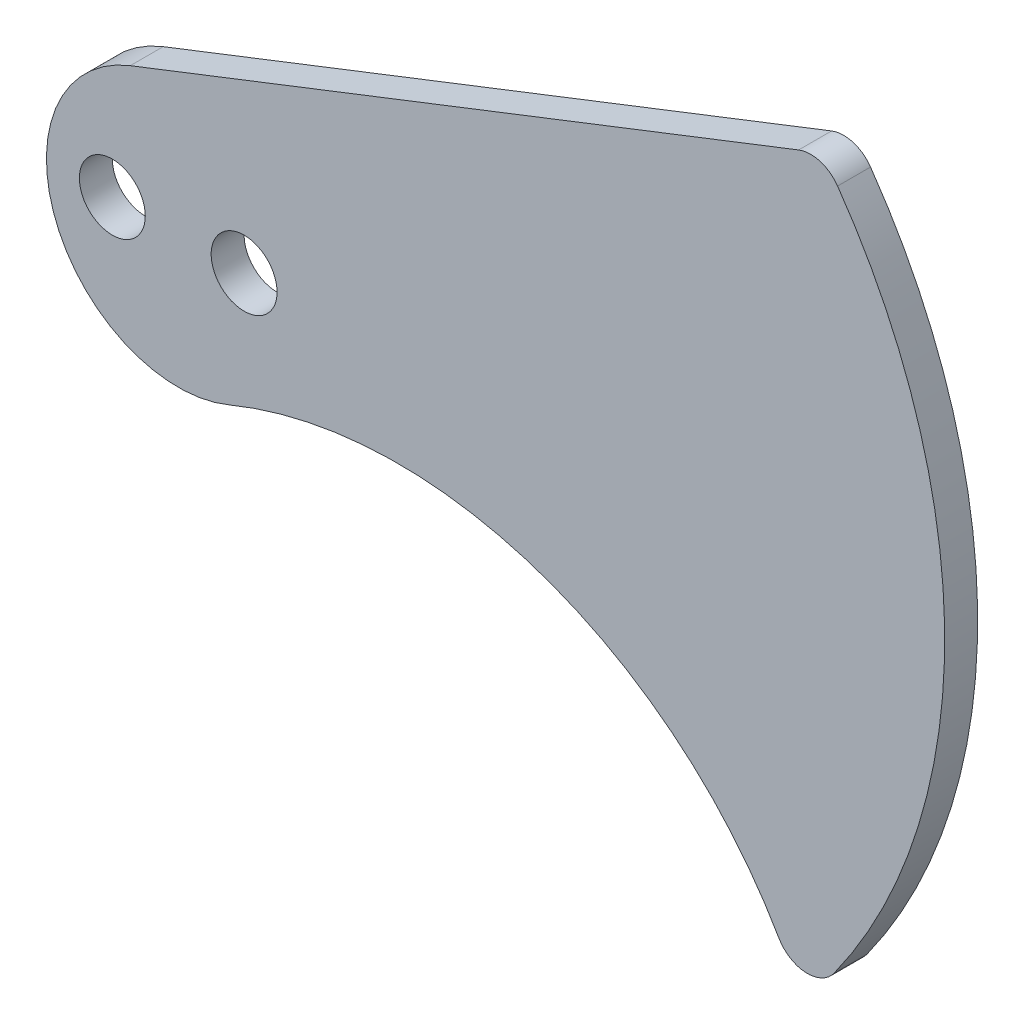
ISO-10303-21;
HEADER;
FILE_DESCRIPTION(('STEP AP214'),'2;1');
FILE_NAME('part.step','',(''),(''),'','','');
FILE_SCHEMA(('AUTOMOTIVE_DESIGN { 1 0 10303 214 1 1 1 1 }'));
ENDSEC;
DATA;
#1=APPLICATION_CONTEXT('core data for automotive mechanical design processes');
#2=APPLICATION_PROTOCOL_DEFINITION('international standard','automotive_design',2000,#1);
#3=PRODUCT_CONTEXT('',#1,'mechanical');
#4=PRODUCT('Part','Part','',(#3));
#5=PRODUCT_RELATED_PRODUCT_CATEGORY('part','',(#4));
#6=PRODUCT_DEFINITION_FORMATION('','',#4);
#7=PRODUCT_DEFINITION_CONTEXT('part definition',#1,'design');
#8=PRODUCT_DEFINITION('design','',#6,#7);
#9=PRODUCT_DEFINITION_SHAPE('','',#8);
#10=(LENGTH_UNIT() NAMED_UNIT(*) SI_UNIT(.MILLI.,.METRE.));
#11=(NAMED_UNIT(*) PLANE_ANGLE_UNIT() SI_UNIT($,.RADIAN.));
#12=(NAMED_UNIT(*) SI_UNIT($,.STERADIAN.) SOLID_ANGLE_UNIT());
#13=UNCERTAINTY_MEASURE_WITH_UNIT(LENGTH_MEASURE(1.E-05),#10,'distance_accuracy_value','');
#14=(GEOMETRIC_REPRESENTATION_CONTEXT(3) GLOBAL_UNCERTAINTY_ASSIGNED_CONTEXT((#13)) GLOBAL_UNIT_ASSIGNED_CONTEXT((#10,
#11,#12)) REPRESENTATION_CONTEXT('',''));
#15=CARTESIAN_POINT('',(0.,0.,0.));
#16=DIRECTION('',(0.,0.,1.));
#17=DIRECTION('',(1.,0.,0.));
#18=AXIS2_PLACEMENT_3D('',#15,#16,#17);
#19=CARTESIAN_POINT('',(20.,-60.,3.));
#20=DIRECTION('',(0.,0.,-1.));
#21=DIRECTION('',(-1.,0.,0.));
#22=AXIS2_PLACEMENT_3D('',#19,#20,#21);
#23=PLANE('',#22);
#24=CARTESIAN_POINT('',(20.,-60.,3.));
#25=DIRECTION('',(0.,0.,-1.));
#26=DIRECTION('',(-1.,0.,0.));
#27=AXIS2_PLACEMENT_3D('',#24,#25,#26);
#28=CIRCLE('',#27,40.);
#29=CARTESIAN_POINT('',(4.61538461538461,-23.0769230769231,3.));
#30=VERTEX_POINT('',#29);
#31=CARTESIAN_POINT('',(54.6838076185731,-40.074300788233,3.));
#32=VERTEX_POINT('',#31);
#33=EDGE_CURVE('E135',#30,#32,#28,.T.);
#34=ORIENTED_EDGE('',*,*,#33,.T.);
#35=CARTESIAN_POINT('',(57.285093189966,-38.5798733473504,3.));
#36=DIRECTION('',(0.,0.,1.));
#37=DIRECTION('',(1.,0.,0.));
#38=AXIS2_PLACEMENT_3D('',#35,#36,#37);
#39=CIRCLE('',#38,3.);
#40=CARTESIAN_POINT('',(59.7237620550911,-40.3271266679281,3.));
#41=VERTEX_POINT('',#40);
#42=EDGE_CURVE('E93',#32,#41,#39,.T.);
#43=ORIENTED_EDGE('',*,*,#42,.T.);
#44=CARTESIAN_POINT('',(16.,-9.,3.));
#45=DIRECTION('',(0.,0.,1.));
#46=DIRECTION('',(1.,0.,0.));
#47=AXIS2_PLACEMENT_3D('',#44,#45,#46);
#48=CIRCLE('',#47,53.7880677615271);
#49=CARTESIAN_POINT('',(60.0353338035634,21.8876287585723,3.));
#50=VERTEX_POINT('',#49);
#51=EDGE_CURVE('E106',#41,#50,#48,.T.);
#52=ORIENTED_EDGE('',*,*,#51,.T.);
#53=CARTESIAN_POINT('',(57.5792871949291,20.1648881930152,3.));
#54=DIRECTION('',(0.,0.,1.));
#55=DIRECTION('',(1.,0.,0.));
#56=AXIS2_PLACEMENT_3D('',#53,#54,#55);
#57=CIRCLE('',#56,3.00000000000001);
#58=CARTESIAN_POINT('',(56.4873093270571,22.9590936858303,3.));
#59=VERTEX_POINT('',#58);
#60=EDGE_CURVE('E100',#50,#59,#57,.T.);
#61=ORIENTED_EDGE('',*,*,#60,.T.);
#62=DIRECTION('',(-0.931401830938352,-0.363992622623983,0.));
#63=VECTOR('',#62,1.);
#64=CARTESIAN_POINT('',(-4.3679114714878,-0.823178028739773,3.));
#65=LINE('',#64,#63);
#66=CARTESIAN_POINT('',(-4.3679114714878,-0.823178028739774,3.));
#67=VERTEX_POINT('',#66);
#68=EDGE_CURVE('E104',#59,#67,#65,.T.);
#69=ORIENTED_EDGE('',*,*,#68,.T.);
#70=CARTESIAN_POINT('',(0.,-12.,3.));
#71=DIRECTION('',(0.,0.,1.));
#72=DIRECTION('',(1.,0.,0.));
#73=AXIS2_PLACEMENT_3D('',#70,#71,#72);
#74=CIRCLE('',#73,12.);
#75=EDGE_CURVE('E56',#67,#30,#74,.T.);
#76=ORIENTED_EDGE('',*,*,#75,.T.);
#77=EDGE_LOOP('',(#34,#43,#52,#61,#69,#76));
#78=FACE_BOUND('',#77,.T.);
#79=CARTESIAN_POINT('',(-6.,-12.,3.));
#80=DIRECTION('',(0.,0.,1.));
#81=DIRECTION('',(1.,0.,0.));
#82=AXIS2_PLACEMENT_3D('',#79,#80,#81);
#83=CIRCLE('',#82,3.);
#84=CARTESIAN_POINT('',(-3.,-12.,3.));
#85=VERTEX_POINT('',#84);
#86=EDGE_CURVE('E128',#85,#85,#83,.T.);
#87=ORIENTED_EDGE('',*,*,#86,.F.);
#88=EDGE_LOOP('',(#87));
#89=FACE_BOUND('',#88,.T.);
#90=CARTESIAN_POINT('',(6.,-12.,3.));
#91=DIRECTION('',(0.,0.,1.));
#92=DIRECTION('',(1.,0.,0.));
#93=AXIS2_PLACEMENT_3D('',#90,#91,#92);
#94=CIRCLE('',#93,3.);
#95=CARTESIAN_POINT('',(9.,-12.,3.));
#96=VERTEX_POINT('',#95);
#97=EDGE_CURVE('E176',#96,#96,#94,.T.);
#98=ORIENTED_EDGE('',*,*,#97,.F.);
#99=EDGE_LOOP('',(#98));
#100=FACE_BOUND('',#99,.T.);
#101=ADVANCED_FACE('F39',(#78,#89,#100),#23,.F.);
#102=CARTESIAN_POINT('',(20.,-60.,0.));
#103=DIRECTION('',(0.,0.,-1.));
#104=DIRECTION('',(-1.,0.,0.));
#105=AXIS2_PLACEMENT_3D('',#102,#103,#104);
#106=PLANE('',#105);
#107=CARTESIAN_POINT('',(-6.,-12.,0.));
#108=DIRECTION('',(0.,0.,1.));
#109=DIRECTION('',(1.,0.,0.));
#110=AXIS2_PLACEMENT_3D('',#107,#108,#109);
#111=CIRCLE('',#110,3.);
#112=CARTESIAN_POINT('',(-3.,-12.,0.));
#113=VERTEX_POINT('',#112);
#114=EDGE_CURVE('E181',#113,#113,#111,.T.);
#115=ORIENTED_EDGE('',*,*,#114,.T.);
#116=EDGE_LOOP('',(#115));
#117=FACE_BOUND('',#116,.T.);
#118=CARTESIAN_POINT('',(20.,-60.,0.));
#119=DIRECTION('',(0.,0.,-1.));
#120=DIRECTION('',(-1.,0.,0.));
#121=AXIS2_PLACEMENT_3D('',#118,#119,#120);
#122=CIRCLE('',#121,40.);
#123=CARTESIAN_POINT('',(4.61538461538461,-23.0769230769231,0.));
#124=VERTEX_POINT('',#123);
#125=CARTESIAN_POINT('',(54.6838076185731,-40.074300788233,0.));
#126=VERTEX_POINT('',#125);
#127=EDGE_CURVE('E124',#124,#126,#122,.T.);
#128=ORIENTED_EDGE('',*,*,#127,.F.);
#129=CARTESIAN_POINT('',(0.,-12.,0.));
#130=DIRECTION('',(0.,0.,1.));
#131=DIRECTION('',(1.,0.,0.));
#132=AXIS2_PLACEMENT_3D('',#129,#130,#131);
#133=CIRCLE('',#132,12.);
#134=CARTESIAN_POINT('',(-4.3679114714878,-0.823178028739774,0.));
#135=VERTEX_POINT('',#134);
#136=EDGE_CURVE('E85',#135,#124,#133,.T.);
#137=ORIENTED_EDGE('',*,*,#136,.F.);
#138=DIRECTION('',(-0.931401830938352,-0.363992622623983,0.));
#139=VECTOR('',#138,1.);
#140=CARTESIAN_POINT('',(-4.3679114714878,-0.823178028739773,0.));
#141=LINE('',#140,#139);
#142=CARTESIAN_POINT('',(56.4873093270571,22.9590936858303,0.));
#143=VERTEX_POINT('',#142);
#144=EDGE_CURVE('E79',#143,#135,#141,.T.);
#145=ORIENTED_EDGE('',*,*,#144,.F.);
#146=CARTESIAN_POINT('',(57.5792871949291,20.1648881930152,0.));
#147=DIRECTION('',(0.,0.,1.));
#148=DIRECTION('',(1.,0.,0.));
#149=AXIS2_PLACEMENT_3D('',#146,#147,#148);
#150=CIRCLE('',#149,3.00000000000001);
#151=CARTESIAN_POINT('',(60.0353338035634,21.8876287585723,0.));
#152=VERTEX_POINT('',#151);
#153=EDGE_CURVE('E114',#152,#143,#150,.T.);
#154=ORIENTED_EDGE('',*,*,#153,.F.);
#155=CARTESIAN_POINT('',(16.,-9.,0.));
#156=DIRECTION('',(0.,0.,1.));
#157=DIRECTION('',(1.,0.,0.));
#158=AXIS2_PLACEMENT_3D('',#155,#156,#157);
#159=CIRCLE('',#158,53.7880677615271);
#160=CARTESIAN_POINT('',(59.7237620550911,-40.3271266679281,0.));
#161=VERTEX_POINT('',#160);
#162=EDGE_CURVE('E130',#161,#152,#159,.T.);
#163=ORIENTED_EDGE('',*,*,#162,.F.);
#164=CARTESIAN_POINT('',(57.285093189966,-38.5798733473504,0.));
#165=DIRECTION('',(0.,0.,1.));
#166=DIRECTION('',(1.,0.,0.));
#167=AXIS2_PLACEMENT_3D('',#164,#165,#166);
#168=CIRCLE('',#167,3.);
#169=EDGE_CURVE('E127',#126,#161,#168,.T.);
#170=ORIENTED_EDGE('',*,*,#169,.F.);
#171=EDGE_LOOP('',(#128,#137,#145,#154,#163,#170));
#172=FACE_BOUND('',#171,.T.);
#173=CARTESIAN_POINT('',(6.,-12.,0.));
#174=DIRECTION('',(0.,0.,1.));
#175=DIRECTION('',(1.,0.,0.));
#176=AXIS2_PLACEMENT_3D('',#173,#174,#175);
#177=CIRCLE('',#176,3.);
#178=CARTESIAN_POINT('',(9.,-12.,0.));
#179=VERTEX_POINT('',#178);
#180=EDGE_CURVE('E179',#179,#179,#177,.T.);
#181=ORIENTED_EDGE('',*,*,#180,.T.);
#182=EDGE_LOOP('',(#181));
#183=FACE_BOUND('',#182,.T.);
#184=ADVANCED_FACE('F144',(#117,#172,#183),#106,.T.);
#185=CARTESIAN_POINT('',(20.,-60.,3.));
#186=DIRECTION('',(0.,0.,-1.));
#187=DIRECTION('',(-1.,0.,0.));
#188=AXIS2_PLACEMENT_3D('',#185,#186,#187);
#189=CYLINDRICAL_SURFACE('',#188,40.);
#190=ORIENTED_EDGE('',*,*,#127,.T.);
#191=DIRECTION('',(0.,0.,-1.));
#192=VECTOR('',#191,1.);
#193=CARTESIAN_POINT('',(54.6838076185731,-40.074300788233,3.));
#194=LINE('',#193,#192);
#195=EDGE_CURVE('E11',#32,#126,#194,.T.);
#196=ORIENTED_EDGE('',*,*,#195,.F.);
#197=ORIENTED_EDGE('',*,*,#33,.F.);
#198=DIRECTION('',(0.,0.,-1.));
#199=VECTOR('',#198,1.);
#200=CARTESIAN_POINT('',(4.61538461538461,-23.0769230769231,3.));
#201=LINE('',#200,#199);
#202=EDGE_CURVE('E120',#30,#124,#201,.T.);
#203=ORIENTED_EDGE('',*,*,#202,.T.);
#204=EDGE_LOOP('',(#190,#196,#197,#203));
#205=FACE_BOUND('',#204,.T.);
#206=ADVANCED_FACE('F41',(#205),#189,.F.);
#207=CARTESIAN_POINT('',(57.285093189966,-38.5798733473504,3.));
#208=DIRECTION('',(0.,0.,-1.));
#209=DIRECTION('',(-1.,0.,0.));
#210=AXIS2_PLACEMENT_3D('',#207,#208,#209);
#211=CYLINDRICAL_SURFACE('',#210,3.);
#212=ORIENTED_EDGE('',*,*,#169,.T.);
#213=DIRECTION('',(0.,0.,-1.));
#214=VECTOR('',#213,1.);
#215=CARTESIAN_POINT('',(59.7237620550911,-40.3271266679281,3.));
#216=LINE('',#215,#214);
#217=EDGE_CURVE('E48',#41,#161,#216,.T.);
#218=ORIENTED_EDGE('',*,*,#217,.F.);
#219=ORIENTED_EDGE('',*,*,#42,.F.);
#220=ORIENTED_EDGE('',*,*,#195,.T.);
#221=EDGE_LOOP('',(#212,#218,#219,#220));
#222=FACE_BOUND('',#221,.T.);
#223=ADVANCED_FACE('F226',(#222),#211,.T.);
#224=CARTESIAN_POINT('',(16.,-9.,3.));
#225=DIRECTION('',(0.,0.,-1.));
#226=DIRECTION('',(-1.,0.,0.));
#227=AXIS2_PLACEMENT_3D('',#224,#225,#226);
#228=CYLINDRICAL_SURFACE('',#227,53.7880677615271);
#229=ORIENTED_EDGE('',*,*,#162,.T.);
#230=DIRECTION('',(0.,0.,-1.));
#231=VECTOR('',#230,1.);
#232=CARTESIAN_POINT('',(60.0353338035634,21.8876287585723,3.));
#233=LINE('',#232,#231);
#234=EDGE_CURVE('E115',#50,#152,#233,.T.);
#235=ORIENTED_EDGE('',*,*,#234,.F.);
#236=ORIENTED_EDGE('',*,*,#51,.F.);
#237=ORIENTED_EDGE('',*,*,#217,.T.);
#238=EDGE_LOOP('',(#229,#235,#236,#237));
#239=FACE_BOUND('',#238,.T.);
#240=ADVANCED_FACE('F141',(#239),#228,.T.);
#241=CARTESIAN_POINT('',(57.5792871949291,20.1648881930152,3.));
#242=DIRECTION('',(0.,0.,-1.));
#243=DIRECTION('',(-1.,0.,0.));
#244=AXIS2_PLACEMENT_3D('',#241,#242,#243);
#245=CYLINDRICAL_SURFACE('',#244,3.00000000000001);
#246=ORIENTED_EDGE('',*,*,#153,.T.);
#247=DIRECTION('',(0.,0.,-1.));
#248=VECTOR('',#247,1.);
#249=CARTESIAN_POINT('',(56.4873093270571,22.9590936858303,3.));
#250=LINE('',#249,#248);
#251=EDGE_CURVE('E111',#59,#143,#250,.T.);
#252=ORIENTED_EDGE('',*,*,#251,.F.);
#253=ORIENTED_EDGE('',*,*,#60,.F.);
#254=ORIENTED_EDGE('',*,*,#234,.T.);
#255=EDGE_LOOP('',(#246,#252,#253,#254));
#256=FACE_BOUND('',#255,.T.);
#257=ADVANCED_FACE('F112',(#256),#245,.T.);
#258=CARTESIAN_POINT('',(-4.3679114714878,-0.823178028739773,3.));
#259=DIRECTION('',(0.363992622623983,-0.931401830938352,0.));
#260=DIRECTION('',(0.931401830938352,0.363992622623983,0.));
#261=AXIS2_PLACEMENT_3D('',#258,#259,#260);
#262=PLANE('',#261);
#263=ORIENTED_EDGE('',*,*,#144,.T.);
#264=DIRECTION('',(0.,0.,-1.));
#265=VECTOR('',#264,1.);
#266=CARTESIAN_POINT('',(-4.3679114714878,-0.823178028739774,3.));
#267=LINE('',#266,#265);
#268=EDGE_CURVE('E116',#67,#135,#267,.T.);
#269=ORIENTED_EDGE('',*,*,#268,.F.);
#270=ORIENTED_EDGE('',*,*,#68,.F.);
#271=ORIENTED_EDGE('',*,*,#251,.T.);
#272=EDGE_LOOP('',(#263,#269,#270,#271));
#273=FACE_BOUND('',#272,.T.);
#274=ADVANCED_FACE('F118',(#273),#262,.F.);
#275=CARTESIAN_POINT('',(0.,-12.,3.));
#276=DIRECTION('',(0.,0.,-1.));
#277=DIRECTION('',(-1.,0.,0.));
#278=AXIS2_PLACEMENT_3D('',#275,#276,#277);
#279=CYLINDRICAL_SURFACE('',#278,12.);
#280=ORIENTED_EDGE('',*,*,#136,.T.);
#281=ORIENTED_EDGE('',*,*,#202,.F.);
#282=ORIENTED_EDGE('',*,*,#75,.F.);
#283=ORIENTED_EDGE('',*,*,#268,.T.);
#284=EDGE_LOOP('',(#280,#281,#282,#283));
#285=FACE_BOUND('',#284,.T.);
#286=ADVANCED_FACE('F149',(#285),#279,.T.);
#287=CARTESIAN_POINT('',(-6.,-12.,3.));
#288=DIRECTION('',(0.,0.,-1.));
#289=DIRECTION('',(-1.,0.,0.));
#290=AXIS2_PLACEMENT_3D('',#287,#288,#289);
#291=CYLINDRICAL_SURFACE('',#290,3.);
#292=ORIENTED_EDGE('',*,*,#86,.T.);
#293=EDGE_LOOP('',(#292));
#294=FACE_BOUND('',#293,.T.);
#295=ORIENTED_EDGE('',*,*,#114,.F.);
#296=EDGE_LOOP('',(#295));
#297=FACE_BOUND('',#296,.T.);
#298=ADVANCED_FACE('F151',(#294,#297),#291,.F.);
#299=CARTESIAN_POINT('',(6.,-12.,3.));
#300=DIRECTION('',(0.,0.,-1.));
#301=DIRECTION('',(-1.,0.,0.));
#302=AXIS2_PLACEMENT_3D('',#299,#300,#301);
#303=CYLINDRICAL_SURFACE('',#302,3.);
#304=ORIENTED_EDGE('',*,*,#97,.T.);
#305=EDGE_LOOP('',(#304));
#306=FACE_BOUND('',#305,.T.);
#307=ORIENTED_EDGE('',*,*,#180,.F.);
#308=EDGE_LOOP('',(#307));
#309=FACE_BOUND('',#308,.T.);
#310=ADVANCED_FACE('F157',(#306,#309),#303,.F.);
#311=CLOSED_SHELL('',(#101,#184,#206,#223,#240,#257,#274,#286,#298,#310));
#312=MANIFOLD_SOLID_BREP('B2',#311);
#313=ADVANCED_BREP_SHAPE_REPRESENTATION('',(#18,#312),#14);
#314=SHAPE_DEFINITION_REPRESENTATION(#9,#313);
ENDSEC;
END-ISO-10303-21;
